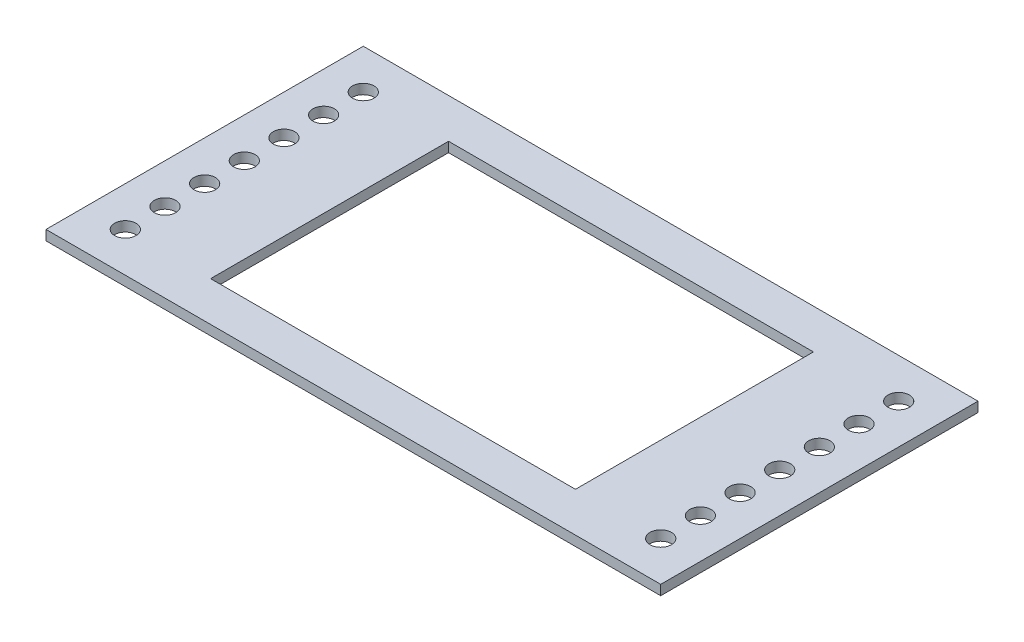
ISO-10303-21;
HEADER;
FILE_DESCRIPTION(('STEP AP214'),'2;1');
FILE_NAME('part.step','',(''),(''),'','','');
FILE_SCHEMA(('AUTOMOTIVE_DESIGN { 1 0 10303 214 1 1 1 1 }'));
ENDSEC;
DATA;
#1=APPLICATION_CONTEXT('core data for automotive mechanical design processes');
#2=APPLICATION_PROTOCOL_DEFINITION('international standard','automotive_design',2000,#1);
#3=PRODUCT_CONTEXT('',#1,'mechanical');
#4=PRODUCT('Part','Part','',(#3));
#5=PRODUCT_RELATED_PRODUCT_CATEGORY('part','',(#4));
#6=PRODUCT_DEFINITION_FORMATION('','',#4);
#7=PRODUCT_DEFINITION_CONTEXT('part definition',#1,'design');
#8=PRODUCT_DEFINITION('design','',#6,#7);
#9=PRODUCT_DEFINITION_SHAPE('','',#8);
#10=(LENGTH_UNIT() NAMED_UNIT(*) SI_UNIT(.MILLI.,.METRE.));
#11=(NAMED_UNIT(*) PLANE_ANGLE_UNIT() SI_UNIT($,.RADIAN.));
#12=(NAMED_UNIT(*) SI_UNIT($,.STERADIAN.) SOLID_ANGLE_UNIT());
#13=UNCERTAINTY_MEASURE_WITH_UNIT(LENGTH_MEASURE(1.E-05),#10,'distance_accuracy_value','');
#14=(GEOMETRIC_REPRESENTATION_CONTEXT(3) GLOBAL_UNCERTAINTY_ASSIGNED_CONTEXT((#13)) GLOBAL_UNIT_ASSIGNED_CONTEXT((#10,
#11,#12)) REPRESENTATION_CONTEXT('',''));
#15=CARTESIAN_POINT('',(0.,0.,0.));
#16=DIRECTION('',(0.,0.,1.));
#17=DIRECTION('',(1.,0.,0.));
#18=AXIS2_PLACEMENT_3D('',#15,#16,#17);
#19=CARTESIAN_POINT('',(0.,3.175,0.));
#20=DIRECTION('',(0.,-1.,0.));
#21=DIRECTION('',(0.,0.,-1.));
#22=AXIS2_PLACEMENT_3D('',#19,#20,#21);
#23=PLANE('',#22);
#24=DIRECTION('',(0.,0.,1.));
#25=VECTOR('',#24,1.);
#26=CARTESIAN_POINT('',(-98.425,3.175,-50.8));
#27=LINE('',#26,#25);
#28=CARTESIAN_POINT('',(-98.425,3.175,-50.8));
#29=VERTEX_POINT('',#28);
#30=CARTESIAN_POINT('',(-98.425,3.175,50.8));
#31=VERTEX_POINT('',#30);
#32=EDGE_CURVE('E137',#29,#31,#27,.T.);
#33=ORIENTED_EDGE('',*,*,#32,.T.);
#34=DIRECTION('',(1.,0.,0.));
#35=VECTOR('',#34,1.);
#36=CARTESIAN_POINT('',(98.425,3.175,50.8));
#37=LINE('',#36,#35);
#38=CARTESIAN_POINT('',(98.425,3.175,50.8));
#39=VERTEX_POINT('',#38);
#40=EDGE_CURVE('E140',#31,#39,#37,.T.);
#41=ORIENTED_EDGE('',*,*,#40,.T.);
#42=DIRECTION('',(0.,0.,-1.));
#43=VECTOR('',#42,1.);
#44=CARTESIAN_POINT('',(98.425,3.175,-50.8));
#45=LINE('',#44,#43);
#46=CARTESIAN_POINT('',(98.425,3.175,-50.8));
#47=VERTEX_POINT('',#46);
#48=EDGE_CURVE('E143',#39,#47,#45,.T.);
#49=ORIENTED_EDGE('',*,*,#48,.T.);
#50=DIRECTION('',(-1.,0.,0.));
#51=VECTOR('',#50,1.);
#52=CARTESIAN_POINT('',(98.425,3.175,-50.8));
#53=LINE('',#52,#51);
#54=EDGE_CURVE('E145',#47,#29,#53,.T.);
#55=ORIENTED_EDGE('',*,*,#54,.T.);
#56=EDGE_LOOP('',(#33,#41,#49,#55));
#57=FACE_BOUND('',#56,.T.);
#58=DIRECTION('',(0.,0.,1.));
#59=VECTOR('',#58,1.);
#60=CARTESIAN_POINT('',(-58.42,3.175,-38.1));
#61=LINE('',#60,#59);
#62=CARTESIAN_POINT('',(-58.42,3.175,-38.1));
#63=VERTEX_POINT('',#62);
#64=CARTESIAN_POINT('',(-58.42,3.175,38.1));
#65=VERTEX_POINT('',#64);
#66=EDGE_CURVE('E98',#63,#65,#61,.T.);
#67=ORIENTED_EDGE('',*,*,#66,.F.);
#68=DIRECTION('',(-1.,0.,0.));
#69=VECTOR('',#68,1.);
#70=CARTESIAN_POINT('',(58.42,3.175,-38.1));
#71=LINE('',#70,#69);
#72=CARTESIAN_POINT('',(58.42,3.175,-38.1));
#73=VERTEX_POINT('',#72);
#74=EDGE_CURVE('E121',#73,#63,#71,.T.);
#75=ORIENTED_EDGE('',*,*,#74,.F.);
#76=DIRECTION('',(0.,0.,-1.));
#77=VECTOR('',#76,1.);
#78=CARTESIAN_POINT('',(58.42,3.175,-38.1));
#79=LINE('',#78,#77);
#80=CARTESIAN_POINT('',(58.42,3.175,38.1));
#81=VERTEX_POINT('',#80);
#82=EDGE_CURVE('E119',#81,#73,#79,.T.);
#83=ORIENTED_EDGE('',*,*,#82,.F.);
#84=DIRECTION('',(1.,0.,0.));
#85=VECTOR('',#84,1.);
#86=CARTESIAN_POINT('',(58.42,3.175,38.1));
#87=LINE('',#86,#85);
#88=EDGE_CURVE('E106',#65,#81,#87,.T.);
#89=ORIENTED_EDGE('',*,*,#88,.F.);
#90=EDGE_LOOP('',(#67,#75,#83,#89));
#91=FACE_BOUND('',#90,.T.);
#92=CARTESIAN_POINT('',(-85.7250000000001,3.175,-38.1));
#93=DIRECTION('',(0.,1.,0.));
#94=DIRECTION('',(0.,0.,1.));
#95=AXIS2_PLACEMENT_3D('',#92,#93,#94);
#96=CIRCLE('',#95,3.429);
#97=CARTESIAN_POINT('',(-85.7250000000001,3.175,-34.671));
#98=VERTEX_POINT('',#97);
#99=EDGE_CURVE('E127',#98,#98,#96,.T.);
#100=ORIENTED_EDGE('',*,*,#99,.F.);
#101=EDGE_LOOP('',(#100));
#102=FACE_BOUND('',#101,.T.);
#103=CARTESIAN_POINT('',(85.725,3.175,-38.1));
#104=DIRECTION('',(0.,1.,0.));
#105=DIRECTION('',(0.,0.,1.));
#106=AXIS2_PLACEMENT_3D('',#103,#104,#105);
#107=CIRCLE('',#106,3.429);
#108=CARTESIAN_POINT('',(85.725,3.175,-34.671));
#109=VERTEX_POINT('',#108);
#110=EDGE_CURVE('E349',#109,#109,#107,.T.);
#111=ORIENTED_EDGE('',*,*,#110,.F.);
#112=EDGE_LOOP('',(#111));
#113=FACE_BOUND('',#112,.T.);
#114=CARTESIAN_POINT('',(85.7250000000001,3.175,-25.4));
#115=DIRECTION('',(0.,1.,0.));
#116=DIRECTION('',(0.,0.,1.));
#117=AXIS2_PLACEMENT_3D('',#114,#115,#116);
#118=CIRCLE('',#117,3.429);
#119=CARTESIAN_POINT('',(85.7250000000001,3.175,-21.971));
#120=VERTEX_POINT('',#119);
#121=EDGE_CURVE('E343',#120,#120,#118,.T.);
#122=ORIENTED_EDGE('',*,*,#121,.F.);
#123=EDGE_LOOP('',(#122));
#124=FACE_BOUND('',#123,.T.);
#125=CARTESIAN_POINT('',(85.7250000000003,3.175,-12.7));
#126=DIRECTION('',(0.,1.,0.));
#127=DIRECTION('',(0.,0.,1.));
#128=AXIS2_PLACEMENT_3D('',#125,#126,#127);
#129=CIRCLE('',#128,3.429);
#130=CARTESIAN_POINT('',(85.7250000000003,3.175,-9.27100000000003));
#131=VERTEX_POINT('',#130);
#132=EDGE_CURVE('E337',#131,#131,#129,.T.);
#133=ORIENTED_EDGE('',*,*,#132,.F.);
#134=EDGE_LOOP('',(#133));
#135=FACE_BOUND('',#134,.T.);
#136=CARTESIAN_POINT('',(85.7250000000003,3.175,0.));
#137=DIRECTION('',(0.,1.,0.));
#138=DIRECTION('',(0.,0.,1.));
#139=AXIS2_PLACEMENT_3D('',#136,#137,#138);
#140=CIRCLE('',#139,3.429);
#141=CARTESIAN_POINT('',(85.7250000000003,3.175,3.42899999999996));
#142=VERTEX_POINT('',#141);
#143=EDGE_CURVE('E331',#142,#142,#140,.T.);
#144=ORIENTED_EDGE('',*,*,#143,.F.);
#145=EDGE_LOOP('',(#144));
#146=FACE_BOUND('',#145,.T.);
#147=CARTESIAN_POINT('',(85.7250000000005,3.175,12.7));
#148=DIRECTION('',(0.,1.,0.));
#149=DIRECTION('',(0.,0.,1.));
#150=AXIS2_PLACEMENT_3D('',#147,#148,#149);
#151=CIRCLE('',#150,3.429);
#152=CARTESIAN_POINT('',(85.7250000000005,3.175,16.129));
#153=VERTEX_POINT('',#152);
#154=EDGE_CURVE('E325',#153,#153,#151,.T.);
#155=ORIENTED_EDGE('',*,*,#154,.F.);
#156=EDGE_LOOP('',(#155));
#157=FACE_BOUND('',#156,.T.);
#158=CARTESIAN_POINT('',(85.7250000000006,3.175,25.3999999999999));
#159=DIRECTION('',(0.,1.,0.));
#160=DIRECTION('',(0.,0.,1.));
#161=AXIS2_PLACEMENT_3D('',#158,#159,#160);
#162=CIRCLE('',#161,3.429);
#163=CARTESIAN_POINT('',(85.7250000000006,3.175,28.8289999999999));
#164=VERTEX_POINT('',#163);
#165=EDGE_CURVE('E319',#164,#164,#162,.T.);
#166=ORIENTED_EDGE('',*,*,#165,.F.);
#167=EDGE_LOOP('',(#166));
#168=FACE_BOUND('',#167,.T.);
#169=CARTESIAN_POINT('',(85.7250000000008,3.175,38.0999999999999));
#170=DIRECTION('',(0.,1.,0.));
#171=DIRECTION('',(0.,0.,1.));
#172=AXIS2_PLACEMENT_3D('',#169,#170,#171);
#173=CIRCLE('',#172,3.429);
#174=CARTESIAN_POINT('',(85.7250000000008,3.175,41.5289999999999));
#175=VERTEX_POINT('',#174);
#176=EDGE_CURVE('E313',#175,#175,#173,.T.);
#177=ORIENTED_EDGE('',*,*,#176,.F.);
#178=EDGE_LOOP('',(#177));
#179=FACE_BOUND('',#178,.T.);
#180=CARTESIAN_POINT('',(-85.7249999999999,3.175,-25.4));
#181=DIRECTION('',(0.,1.,0.));
#182=DIRECTION('',(0.,0.,1.));
#183=AXIS2_PLACEMENT_3D('',#180,#181,#182);
#184=CIRCLE('',#183,3.429);
#185=CARTESIAN_POINT('',(-85.7249999999999,3.175,-21.971));
#186=VERTEX_POINT('',#185);
#187=EDGE_CURVE('E307',#186,#186,#184,.T.);
#188=ORIENTED_EDGE('',*,*,#187,.F.);
#189=EDGE_LOOP('',(#188));
#190=FACE_BOUND('',#189,.T.);
#191=CARTESIAN_POINT('',(-85.7249999999998,3.175,-12.7));
#192=DIRECTION('',(0.,1.,0.));
#193=DIRECTION('',(0.,0.,1.));
#194=AXIS2_PLACEMENT_3D('',#191,#192,#193);
#195=CIRCLE('',#194,3.429);
#196=CARTESIAN_POINT('',(-85.7249999999998,3.175,-9.27100000000003));
#197=VERTEX_POINT('',#196);
#198=EDGE_CURVE('E301',#197,#197,#195,.T.);
#199=ORIENTED_EDGE('',*,*,#198,.F.);
#200=EDGE_LOOP('',(#199));
#201=FACE_BOUND('',#200,.T.);
#202=CARTESIAN_POINT('',(-85.7249999999997,3.175,0.));
#203=DIRECTION('',(0.,1.,0.));
#204=DIRECTION('',(0.,0.,1.));
#205=AXIS2_PLACEMENT_3D('',#202,#203,#204);
#206=CIRCLE('',#205,3.429);
#207=CARTESIAN_POINT('',(-85.7249999999997,3.175,3.42899999999996));
#208=VERTEX_POINT('',#207);
#209=EDGE_CURVE('E295',#208,#208,#206,.T.);
#210=ORIENTED_EDGE('',*,*,#209,.F.);
#211=EDGE_LOOP('',(#210));
#212=FACE_BOUND('',#211,.T.);
#213=CARTESIAN_POINT('',(-85.7249999999995,3.175,12.7));
#214=DIRECTION('',(0.,1.,0.));
#215=DIRECTION('',(0.,0.,1.));
#216=AXIS2_PLACEMENT_3D('',#213,#214,#215);
#217=CIRCLE('',#216,3.429);
#218=CARTESIAN_POINT('',(-85.7249999999995,3.175,16.129));
#219=VERTEX_POINT('',#218);
#220=EDGE_CURVE('E289',#219,#219,#217,.T.);
#221=ORIENTED_EDGE('',*,*,#220,.F.);
#222=EDGE_LOOP('',(#221));
#223=FACE_BOUND('',#222,.T.);
#224=CARTESIAN_POINT('',(-85.7249999999994,3.175,25.3999999999999));
#225=DIRECTION('',(0.,1.,0.));
#226=DIRECTION('',(0.,0.,1.));
#227=AXIS2_PLACEMENT_3D('',#224,#225,#226);
#228=CIRCLE('',#227,3.429);
#229=CARTESIAN_POINT('',(-85.7249999999994,3.175,28.8289999999999));
#230=VERTEX_POINT('',#229);
#231=EDGE_CURVE('E283',#230,#230,#228,.T.);
#232=ORIENTED_EDGE('',*,*,#231,.F.);
#233=EDGE_LOOP('',(#232));
#234=FACE_BOUND('',#233,.T.);
#235=CARTESIAN_POINT('',(-85.7249999999992,3.175,38.0999999999999));
#236=DIRECTION('',(0.,1.,0.));
#237=DIRECTION('',(0.,0.,1.));
#238=AXIS2_PLACEMENT_3D('',#235,#236,#237);
#239=CIRCLE('',#238,3.429);
#240=CARTESIAN_POINT('',(-85.7249999999992,3.175,41.5289999999999));
#241=VERTEX_POINT('',#240);
#242=EDGE_CURVE('E274',#241,#241,#239,.T.);
#243=ORIENTED_EDGE('',*,*,#242,.F.);
#244=EDGE_LOOP('',(#243));
#245=FACE_BOUND('',#244,.T.);
#246=ADVANCED_FACE('F33',(#57,#91,#102,#113,#124,#135,#146,#157,#168,#179,#190,#201,#212,#223,
#234,#245),#23,.F.);
#247=CARTESIAN_POINT('',(0.,0.,0.));
#248=DIRECTION('',(0.,-1.,0.));
#249=DIRECTION('',(0.,0.,-1.));
#250=AXIS2_PLACEMENT_3D('',#247,#248,#249);
#251=PLANE('',#250);
#252=CARTESIAN_POINT('',(-85.7249999999994,0.,25.3999999999999));
#253=DIRECTION('',(0.,1.,0.));
#254=DIRECTION('',(0.,0.,1.));
#255=AXIS2_PLACEMENT_3D('',#252,#253,#254);
#256=CIRCLE('',#255,3.429);
#257=CARTESIAN_POINT('',(-85.7249999999994,0.,28.8289999999999));
#258=VERTEX_POINT('',#257);
#259=EDGE_CURVE('E280',#258,#258,#256,.T.);
#260=ORIENTED_EDGE('',*,*,#259,.T.);
#261=EDGE_LOOP('',(#260));
#262=FACE_BOUND('',#261,.T.);
#263=CARTESIAN_POINT('',(-85.7249999999997,0.,0.));
#264=DIRECTION('',(0.,1.,0.));
#265=DIRECTION('',(0.,0.,1.));
#266=AXIS2_PLACEMENT_3D('',#263,#264,#265);
#267=CIRCLE('',#266,3.429);
#268=CARTESIAN_POINT('',(-85.7249999999997,0.,3.42899999999996));
#269=VERTEX_POINT('',#268);
#270=EDGE_CURVE('E292',#269,#269,#267,.T.);
#271=ORIENTED_EDGE('',*,*,#270,.T.);
#272=EDGE_LOOP('',(#271));
#273=FACE_BOUND('',#272,.T.);
#274=CARTESIAN_POINT('',(-85.7249999999999,0.,-25.4));
#275=DIRECTION('',(0.,1.,0.));
#276=DIRECTION('',(0.,0.,1.));
#277=AXIS2_PLACEMENT_3D('',#274,#275,#276);
#278=CIRCLE('',#277,3.429);
#279=CARTESIAN_POINT('',(-85.7249999999999,0.,-21.971));
#280=VERTEX_POINT('',#279);
#281=EDGE_CURVE('E304',#280,#280,#278,.T.);
#282=ORIENTED_EDGE('',*,*,#281,.T.);
#283=EDGE_LOOP('',(#282));
#284=FACE_BOUND('',#283,.T.);
#285=CARTESIAN_POINT('',(85.7250000000006,0.,25.3999999999999));
#286=DIRECTION('',(0.,1.,0.));
#287=DIRECTION('',(0.,0.,1.));
#288=AXIS2_PLACEMENT_3D('',#285,#286,#287);
#289=CIRCLE('',#288,3.429);
#290=CARTESIAN_POINT('',(85.7250000000006,0.,28.8289999999999));
#291=VERTEX_POINT('',#290);
#292=EDGE_CURVE('E316',#291,#291,#289,.T.);
#293=ORIENTED_EDGE('',*,*,#292,.T.);
#294=EDGE_LOOP('',(#293));
#295=FACE_BOUND('',#294,.T.);
#296=CARTESIAN_POINT('',(85.7250000000003,0.,0.));
#297=DIRECTION('',(0.,1.,0.));
#298=DIRECTION('',(0.,0.,1.));
#299=AXIS2_PLACEMENT_3D('',#296,#297,#298);
#300=CIRCLE('',#299,3.429);
#301=CARTESIAN_POINT('',(85.7250000000003,0.,3.42899999999996));
#302=VERTEX_POINT('',#301);
#303=EDGE_CURVE('E328',#302,#302,#300,.T.);
#304=ORIENTED_EDGE('',*,*,#303,.T.);
#305=EDGE_LOOP('',(#304));
#306=FACE_BOUND('',#305,.T.);
#307=CARTESIAN_POINT('',(85.7250000000001,0.,-25.4));
#308=DIRECTION('',(0.,1.,0.));
#309=DIRECTION('',(0.,0.,1.));
#310=AXIS2_PLACEMENT_3D('',#307,#308,#309);
#311=CIRCLE('',#310,3.429);
#312=CARTESIAN_POINT('',(85.7250000000001,0.,-21.971));
#313=VERTEX_POINT('',#312);
#314=EDGE_CURVE('E340',#313,#313,#311,.T.);
#315=ORIENTED_EDGE('',*,*,#314,.T.);
#316=EDGE_LOOP('',(#315));
#317=FACE_BOUND('',#316,.T.);
#318=CARTESIAN_POINT('',(-85.7250000000001,0.,-38.1));
#319=DIRECTION('',(0.,1.,0.));
#320=DIRECTION('',(0.,0.,1.));
#321=AXIS2_PLACEMENT_3D('',#318,#319,#320);
#322=CIRCLE('',#321,3.429);
#323=CARTESIAN_POINT('',(-85.7250000000001,0.,-34.671));
#324=VERTEX_POINT('',#323);
#325=EDGE_CURVE('E352',#324,#324,#322,.T.);
#326=ORIENTED_EDGE('',*,*,#325,.T.);
#327=EDGE_LOOP('',(#326));
#328=FACE_BOUND('',#327,.T.);
#329=DIRECTION('',(0.,0.,1.));
#330=VECTOR('',#329,1.);
#331=CARTESIAN_POINT('',(-98.425,0.,-50.8));
#332=LINE('',#331,#330);
#333=CARTESIAN_POINT('',(-98.425,0.,-50.8));
#334=VERTEX_POINT('',#333);
#335=CARTESIAN_POINT('',(-98.425,0.,50.8));
#336=VERTEX_POINT('',#335);
#337=EDGE_CURVE('E114',#334,#336,#332,.T.);
#338=ORIENTED_EDGE('',*,*,#337,.F.);
#339=DIRECTION('',(-1.,0.,0.));
#340=VECTOR('',#339,1.);
#341=CARTESIAN_POINT('',(98.425,0.,-50.8));
#342=LINE('',#341,#340);
#343=CARTESIAN_POINT('',(98.425,0.,-50.8));
#344=VERTEX_POINT('',#343);
#345=EDGE_CURVE('E141',#344,#334,#342,.T.);
#346=ORIENTED_EDGE('',*,*,#345,.F.);
#347=DIRECTION('',(0.,0.,-1.));
#348=VECTOR('',#347,1.);
#349=CARTESIAN_POINT('',(98.425,0.,-50.8));
#350=LINE('',#349,#348);
#351=CARTESIAN_POINT('',(98.425,0.,50.8));
#352=VERTEX_POINT('',#351);
#353=EDGE_CURVE('E152',#352,#344,#350,.T.);
#354=ORIENTED_EDGE('',*,*,#353,.F.);
#355=DIRECTION('',(1.,0.,0.));
#356=VECTOR('',#355,1.);
#357=CARTESIAN_POINT('',(98.425,0.,50.8));
#358=LINE('',#357,#356);
#359=EDGE_CURVE('E150',#336,#352,#358,.T.);
#360=ORIENTED_EDGE('',*,*,#359,.F.);
#361=EDGE_LOOP('',(#338,#346,#354,#360));
#362=FACE_BOUND('',#361,.T.);
#363=DIRECTION('',(-1.,0.,0.));
#364=VECTOR('',#363,1.);
#365=CARTESIAN_POINT('',(58.42,0.,-38.1));
#366=LINE('',#365,#364);
#367=CARTESIAN_POINT('',(58.42,0.,-38.1));
#368=VERTEX_POINT('',#367);
#369=CARTESIAN_POINT('',(-58.42,0.,-38.1));
#370=VERTEX_POINT('',#369);
#371=EDGE_CURVE('E107',#368,#370,#366,.T.);
#372=ORIENTED_EDGE('',*,*,#371,.T.);
#373=DIRECTION('',(0.,0.,1.));
#374=VECTOR('',#373,1.);
#375=CARTESIAN_POINT('',(-58.42,0.,-38.1));
#376=LINE('',#375,#374);
#377=CARTESIAN_POINT('',(-58.42,0.,38.1));
#378=VERTEX_POINT('',#377);
#379=EDGE_CURVE('E56',#370,#378,#376,.T.);
#380=ORIENTED_EDGE('',*,*,#379,.T.);
#381=DIRECTION('',(1.,0.,0.));
#382=VECTOR('',#381,1.);
#383=CARTESIAN_POINT('',(58.42,0.,38.1));
#384=LINE('',#383,#382);
#385=CARTESIAN_POINT('',(58.42,0.,38.1));
#386=VERTEX_POINT('',#385);
#387=EDGE_CURVE('E113',#378,#386,#384,.T.);
#388=ORIENTED_EDGE('',*,*,#387,.T.);
#389=DIRECTION('',(0.,0.,-1.));
#390=VECTOR('',#389,1.);
#391=CARTESIAN_POINT('',(58.42,0.,-38.1));
#392=LINE('',#391,#390);
#393=EDGE_CURVE('E129',#386,#368,#392,.T.);
#394=ORIENTED_EDGE('',*,*,#393,.T.);
#395=EDGE_LOOP('',(#372,#380,#388,#394));
#396=FACE_BOUND('',#395,.T.);
#397=CARTESIAN_POINT('',(85.725,0.,-38.1));
#398=DIRECTION('',(0.,1.,0.));
#399=DIRECTION('',(0.,0.,1.));
#400=AXIS2_PLACEMENT_3D('',#397,#398,#399);
#401=CIRCLE('',#400,3.429);
#402=CARTESIAN_POINT('',(85.725,0.,-34.671));
#403=VERTEX_POINT('',#402);
#404=EDGE_CURVE('E346',#403,#403,#401,.T.);
#405=ORIENTED_EDGE('',*,*,#404,.T.);
#406=EDGE_LOOP('',(#405));
#407=FACE_BOUND('',#406,.T.);
#408=CARTESIAN_POINT('',(85.7250000000003,0.,-12.7));
#409=DIRECTION('',(0.,1.,0.));
#410=DIRECTION('',(0.,0.,1.));
#411=AXIS2_PLACEMENT_3D('',#408,#409,#410);
#412=CIRCLE('',#411,3.429);
#413=CARTESIAN_POINT('',(85.7250000000003,0.,-9.27100000000003));
#414=VERTEX_POINT('',#413);
#415=EDGE_CURVE('E334',#414,#414,#412,.T.);
#416=ORIENTED_EDGE('',*,*,#415,.T.);
#417=EDGE_LOOP('',(#416));
#418=FACE_BOUND('',#417,.T.);
#419=CARTESIAN_POINT('',(85.7250000000005,0.,12.7));
#420=DIRECTION('',(0.,1.,0.));
#421=DIRECTION('',(0.,0.,1.));
#422=AXIS2_PLACEMENT_3D('',#419,#420,#421);
#423=CIRCLE('',#422,3.429);
#424=CARTESIAN_POINT('',(85.7250000000005,0.,16.129));
#425=VERTEX_POINT('',#424);
#426=EDGE_CURVE('E322',#425,#425,#423,.T.);
#427=ORIENTED_EDGE('',*,*,#426,.T.);
#428=EDGE_LOOP('',(#427));
#429=FACE_BOUND('',#428,.T.);
#430=CARTESIAN_POINT('',(85.7250000000008,0.,38.0999999999999));
#431=DIRECTION('',(0.,1.,0.));
#432=DIRECTION('',(0.,0.,1.));
#433=AXIS2_PLACEMENT_3D('',#430,#431,#432);
#434=CIRCLE('',#433,3.429);
#435=CARTESIAN_POINT('',(85.7250000000008,0.,41.5289999999999));
#436=VERTEX_POINT('',#435);
#437=EDGE_CURVE('E310',#436,#436,#434,.T.);
#438=ORIENTED_EDGE('',*,*,#437,.T.);
#439=EDGE_LOOP('',(#438));
#440=FACE_BOUND('',#439,.T.);
#441=CARTESIAN_POINT('',(-85.7249999999998,0.,-12.7));
#442=DIRECTION('',(0.,1.,0.));
#443=DIRECTION('',(0.,0.,1.));
#444=AXIS2_PLACEMENT_3D('',#441,#442,#443);
#445=CIRCLE('',#444,3.429);
#446=CARTESIAN_POINT('',(-85.7249999999998,0.,-9.27100000000003));
#447=VERTEX_POINT('',#446);
#448=EDGE_CURVE('E298',#447,#447,#445,.T.);
#449=ORIENTED_EDGE('',*,*,#448,.T.);
#450=EDGE_LOOP('',(#449));
#451=FACE_BOUND('',#450,.T.);
#452=CARTESIAN_POINT('',(-85.7249999999995,0.,12.7));
#453=DIRECTION('',(0.,1.,0.));
#454=DIRECTION('',(0.,0.,1.));
#455=AXIS2_PLACEMENT_3D('',#452,#453,#454);
#456=CIRCLE('',#455,3.429);
#457=CARTESIAN_POINT('',(-85.7249999999995,0.,16.129));
#458=VERTEX_POINT('',#457);
#459=EDGE_CURVE('E286',#458,#458,#456,.T.);
#460=ORIENTED_EDGE('',*,*,#459,.T.);
#461=EDGE_LOOP('',(#460));
#462=FACE_BOUND('',#461,.T.);
#463=CARTESIAN_POINT('',(-85.7249999999992,0.,38.0999999999999));
#464=DIRECTION('',(0.,1.,0.));
#465=DIRECTION('',(0.,0.,1.));
#466=AXIS2_PLACEMENT_3D('',#463,#464,#465);
#467=CIRCLE('',#466,3.429);
#468=CARTESIAN_POINT('',(-85.7249999999992,0.,41.5289999999999));
#469=VERTEX_POINT('',#468);
#470=EDGE_CURVE('E277',#469,#469,#467,.T.);
#471=ORIENTED_EDGE('',*,*,#470,.T.);
#472=EDGE_LOOP('',(#471));
#473=FACE_BOUND('',#472,.T.);
#474=ADVANCED_FACE('F170',(#262,#273,#284,#295,#306,#317,#328,#362,#396,#407,#418,#429,#440,
#451,#462,#473),#251,.T.);
#475=CARTESIAN_POINT('',(-98.425,3.175,-50.8));
#476=DIRECTION('',(1.,0.,0.));
#477=DIRECTION('',(0.,0.,-1.));
#478=AXIS2_PLACEMENT_3D('',#475,#476,#477);
#479=PLANE('',#478);
#480=ORIENTED_EDGE('',*,*,#337,.T.);
#481=DIRECTION('',(0.,-1.,0.));
#482=VECTOR('',#481,1.);
#483=CARTESIAN_POINT('',(-98.425,3.175,50.8));
#484=LINE('',#483,#482);
#485=EDGE_CURVE('E11',#31,#336,#484,.T.);
#486=ORIENTED_EDGE('',*,*,#485,.F.);
#487=ORIENTED_EDGE('',*,*,#32,.F.);
#488=DIRECTION('',(0.,-1.,0.));
#489=VECTOR('',#488,1.);
#490=CARTESIAN_POINT('',(-98.425,3.175,-50.8));
#491=LINE('',#490,#489);
#492=EDGE_CURVE('E147',#29,#334,#491,.T.);
#493=ORIENTED_EDGE('',*,*,#492,.T.);
#494=EDGE_LOOP('',(#480,#486,#487,#493));
#495=FACE_BOUND('',#494,.T.);
#496=ADVANCED_FACE('F35',(#495),#479,.F.);
#497=CARTESIAN_POINT('',(98.425,3.175,50.8));
#498=DIRECTION('',(0.,0.,-1.));
#499=DIRECTION('',(-1.,0.,0.));
#500=AXIS2_PLACEMENT_3D('',#497,#498,#499);
#501=PLANE('',#500);
#502=ORIENTED_EDGE('',*,*,#359,.T.);
#503=DIRECTION('',(0.,-1.,0.));
#504=VECTOR('',#503,1.);
#505=CARTESIAN_POINT('',(98.425,3.175,50.8));
#506=LINE('',#505,#504);
#507=EDGE_CURVE('E41',#39,#352,#506,.T.);
#508=ORIENTED_EDGE('',*,*,#507,.F.);
#509=ORIENTED_EDGE('',*,*,#40,.F.);
#510=ORIENTED_EDGE('',*,*,#485,.T.);
#511=EDGE_LOOP('',(#502,#508,#509,#510));
#512=FACE_BOUND('',#511,.T.);
#513=ADVANCED_FACE('F180',(#512),#501,.F.);
#514=CARTESIAN_POINT('',(98.425,3.175,-50.8));
#515=DIRECTION('',(-1.,0.,0.));
#516=DIRECTION('',(0.,0.,1.));
#517=AXIS2_PLACEMENT_3D('',#514,#515,#516);
#518=PLANE('',#517);
#519=ORIENTED_EDGE('',*,*,#353,.T.);
#520=DIRECTION('',(0.,-1.,0.));
#521=VECTOR('',#520,1.);
#522=CARTESIAN_POINT('',(98.425,3.175,-50.8));
#523=LINE('',#522,#521);
#524=EDGE_CURVE('E157',#47,#344,#523,.T.);
#525=ORIENTED_EDGE('',*,*,#524,.F.);
#526=ORIENTED_EDGE('',*,*,#48,.F.);
#527=ORIENTED_EDGE('',*,*,#507,.T.);
#528=EDGE_LOOP('',(#519,#525,#526,#527));
#529=FACE_BOUND('',#528,.T.);
#530=ADVANCED_FACE('F164',(#529),#518,.F.);
#531=CARTESIAN_POINT('',(98.425,3.175,-50.8));
#532=DIRECTION('',(0.,0.,1.));
#533=DIRECTION('',(1.,0.,0.));
#534=AXIS2_PLACEMENT_3D('',#531,#532,#533);
#535=PLANE('',#534);
#536=ORIENTED_EDGE('',*,*,#345,.T.);
#537=ORIENTED_EDGE('',*,*,#492,.F.);
#538=ORIENTED_EDGE('',*,*,#54,.F.);
#539=ORIENTED_EDGE('',*,*,#524,.T.);
#540=EDGE_LOOP('',(#536,#537,#538,#539));
#541=FACE_BOUND('',#540,.T.);
#542=ADVANCED_FACE('F174',(#541),#535,.F.);
#543=CARTESIAN_POINT('',(-58.42,3.175,-38.1));
#544=DIRECTION('',(1.,0.,0.));
#545=DIRECTION('',(0.,0.,-1.));
#546=AXIS2_PLACEMENT_3D('',#543,#544,#545);
#547=PLANE('',#546);
#548=ORIENTED_EDGE('',*,*,#379,.F.);
#549=DIRECTION('',(0.,-1.,0.));
#550=VECTOR('',#549,1.);
#551=CARTESIAN_POINT('',(-58.42,3.175,-38.1));
#552=LINE('',#551,#550);
#553=EDGE_CURVE('E102',#63,#370,#552,.T.);
#554=ORIENTED_EDGE('',*,*,#553,.F.);
#555=ORIENTED_EDGE('',*,*,#66,.T.);
#556=DIRECTION('',(0.,-1.,0.));
#557=VECTOR('',#556,1.);
#558=CARTESIAN_POINT('',(-58.42,3.175,38.1));
#559=LINE('',#558,#557);
#560=EDGE_CURVE('E101',#65,#378,#559,.T.);
#561=ORIENTED_EDGE('',*,*,#560,.T.);
#562=EDGE_LOOP('',(#548,#554,#555,#561));
#563=FACE_BOUND('',#562,.T.);
#564=ADVANCED_FACE('F100',(#563),#547,.T.);
#565=CARTESIAN_POINT('',(58.42,3.175,38.1));
#566=DIRECTION('',(0.,0.,-1.));
#567=DIRECTION('',(-1.,0.,0.));
#568=AXIS2_PLACEMENT_3D('',#565,#566,#567);
#569=PLANE('',#568);
#570=ORIENTED_EDGE('',*,*,#387,.F.);
#571=ORIENTED_EDGE('',*,*,#560,.F.);
#572=ORIENTED_EDGE('',*,*,#88,.T.);
#573=DIRECTION('',(0.,-1.,0.));
#574=VECTOR('',#573,1.);
#575=CARTESIAN_POINT('',(58.42,3.175,38.1));
#576=LINE('',#575,#574);
#577=EDGE_CURVE('E115',#81,#386,#576,.T.);
#578=ORIENTED_EDGE('',*,*,#577,.T.);
#579=EDGE_LOOP('',(#570,#571,#572,#578));
#580=FACE_BOUND('',#579,.T.);
#581=ADVANCED_FACE('F110',(#580),#569,.T.);
#582=CARTESIAN_POINT('',(58.42,3.175,-38.1));
#583=DIRECTION('',(-1.,0.,0.));
#584=DIRECTION('',(0.,0.,1.));
#585=AXIS2_PLACEMENT_3D('',#582,#583,#584);
#586=PLANE('',#585);
#587=ORIENTED_EDGE('',*,*,#393,.F.);
#588=ORIENTED_EDGE('',*,*,#577,.F.);
#589=ORIENTED_EDGE('',*,*,#82,.T.);
#590=DIRECTION('',(0.,-1.,0.));
#591=VECTOR('',#590,1.);
#592=CARTESIAN_POINT('',(58.42,3.175,-38.1));
#593=LINE('',#592,#591);
#594=EDGE_CURVE('E48',#73,#368,#593,.T.);
#595=ORIENTED_EDGE('',*,*,#594,.T.);
#596=EDGE_LOOP('',(#587,#588,#589,#595));
#597=FACE_BOUND('',#596,.T.);
#598=ADVANCED_FACE('F204',(#597),#586,.T.);
#599=CARTESIAN_POINT('',(58.42,3.175,-38.1));
#600=DIRECTION('',(0.,0.,1.));
#601=DIRECTION('',(1.,0.,0.));
#602=AXIS2_PLACEMENT_3D('',#599,#600,#601);
#603=PLANE('',#602);
#604=ORIENTED_EDGE('',*,*,#371,.F.);
#605=ORIENTED_EDGE('',*,*,#594,.F.);
#606=ORIENTED_EDGE('',*,*,#74,.T.);
#607=ORIENTED_EDGE('',*,*,#553,.T.);
#608=EDGE_LOOP('',(#604,#605,#606,#607));
#609=FACE_BOUND('',#608,.T.);
#610=ADVANCED_FACE('F208',(#609),#603,.T.);
#611=CARTESIAN_POINT('',(-85.7250000000001,3.175,-38.1));
#612=DIRECTION('',(0.,-1.,0.));
#613=DIRECTION('',(0.,0.,-1.));
#614=AXIS2_PLACEMENT_3D('',#611,#612,#613);
#615=CYLINDRICAL_SURFACE('',#614,3.429);
#616=ORIENTED_EDGE('',*,*,#99,.T.);
#617=EDGE_LOOP('',(#616));
#618=FACE_BOUND('',#617,.T.);
#619=ORIENTED_EDGE('',*,*,#325,.F.);
#620=EDGE_LOOP('',(#619));
#621=FACE_BOUND('',#620,.T.);
#622=ADVANCED_FACE('F214',(#618,#621),#615,.F.);
#623=CARTESIAN_POINT('',(85.725,3.175,-38.1));
#624=DIRECTION('',(0.,-1.,0.));
#625=DIRECTION('',(0.,0.,-1.));
#626=AXIS2_PLACEMENT_3D('',#623,#624,#625);
#627=CYLINDRICAL_SURFACE('',#626,3.429);
#628=ORIENTED_EDGE('',*,*,#110,.T.);
#629=EDGE_LOOP('',(#628));
#630=FACE_BOUND('',#629,.T.);
#631=ORIENTED_EDGE('',*,*,#404,.F.);
#632=EDGE_LOOP('',(#631));
#633=FACE_BOUND('',#632,.T.);
#634=ADVANCED_FACE('F217',(#630,#633),#627,.F.);
#635=CARTESIAN_POINT('',(85.7250000000001,3.175,-25.4));
#636=DIRECTION('',(0.,-1.,0.));
#637=DIRECTION('',(0.,0.,-1.));
#638=AXIS2_PLACEMENT_3D('',#635,#636,#637);
#639=CYLINDRICAL_SURFACE('',#638,3.429);
#640=ORIENTED_EDGE('',*,*,#121,.T.);
#641=EDGE_LOOP('',(#640));
#642=FACE_BOUND('',#641,.T.);
#643=ORIENTED_EDGE('',*,*,#314,.F.);
#644=EDGE_LOOP('',(#643));
#645=FACE_BOUND('',#644,.T.);
#646=ADVANCED_FACE('F221',(#642,#645),#639,.F.);
#647=CARTESIAN_POINT('',(85.7250000000003,3.175,-12.7));
#648=DIRECTION('',(0.,-1.,0.));
#649=DIRECTION('',(0.,0.,-1.));
#650=AXIS2_PLACEMENT_3D('',#647,#648,#649);
#651=CYLINDRICAL_SURFACE('',#650,3.429);
#652=ORIENTED_EDGE('',*,*,#132,.T.);
#653=EDGE_LOOP('',(#652));
#654=FACE_BOUND('',#653,.T.);
#655=ORIENTED_EDGE('',*,*,#415,.F.);
#656=EDGE_LOOP('',(#655));
#657=FACE_BOUND('',#656,.T.);
#658=ADVANCED_FACE('F225',(#654,#657),#651,.F.);
#659=CARTESIAN_POINT('',(85.7250000000003,3.175,0.));
#660=DIRECTION('',(0.,-1.,0.));
#661=DIRECTION('',(0.,0.,-1.));
#662=AXIS2_PLACEMENT_3D('',#659,#660,#661);
#663=CYLINDRICAL_SURFACE('',#662,3.429);
#664=ORIENTED_EDGE('',*,*,#143,.T.);
#665=EDGE_LOOP('',(#664));
#666=FACE_BOUND('',#665,.T.);
#667=ORIENTED_EDGE('',*,*,#303,.F.);
#668=EDGE_LOOP('',(#667));
#669=FACE_BOUND('',#668,.T.);
#670=ADVANCED_FACE('F229',(#666,#669),#663,.F.);
#671=CARTESIAN_POINT('',(85.7250000000005,3.175,12.7));
#672=DIRECTION('',(0.,-1.,0.));
#673=DIRECTION('',(0.,0.,-1.));
#674=AXIS2_PLACEMENT_3D('',#671,#672,#673);
#675=CYLINDRICAL_SURFACE('',#674,3.429);
#676=ORIENTED_EDGE('',*,*,#154,.T.);
#677=EDGE_LOOP('',(#676));
#678=FACE_BOUND('',#677,.T.);
#679=ORIENTED_EDGE('',*,*,#426,.F.);
#680=EDGE_LOOP('',(#679));
#681=FACE_BOUND('',#680,.T.);
#682=ADVANCED_FACE('F233',(#678,#681),#675,.F.);
#683=CARTESIAN_POINT('',(85.7250000000006,3.175,25.3999999999999));
#684=DIRECTION('',(0.,-1.,0.));
#685=DIRECTION('',(0.,0.,-1.));
#686=AXIS2_PLACEMENT_3D('',#683,#684,#685);
#687=CYLINDRICAL_SURFACE('',#686,3.429);
#688=ORIENTED_EDGE('',*,*,#165,.T.);
#689=EDGE_LOOP('',(#688));
#690=FACE_BOUND('',#689,.T.);
#691=ORIENTED_EDGE('',*,*,#292,.F.);
#692=EDGE_LOOP('',(#691));
#693=FACE_BOUND('',#692,.T.);
#694=ADVANCED_FACE('F237',(#690,#693),#687,.F.);
#695=CARTESIAN_POINT('',(85.7250000000008,3.175,38.0999999999999));
#696=DIRECTION('',(0.,-1.,0.));
#697=DIRECTION('',(0.,0.,-1.));
#698=AXIS2_PLACEMENT_3D('',#695,#696,#697);
#699=CYLINDRICAL_SURFACE('',#698,3.429);
#700=ORIENTED_EDGE('',*,*,#176,.T.);
#701=EDGE_LOOP('',(#700));
#702=FACE_BOUND('',#701,.T.);
#703=ORIENTED_EDGE('',*,*,#437,.F.);
#704=EDGE_LOOP('',(#703));
#705=FACE_BOUND('',#704,.T.);
#706=ADVANCED_FACE('F241',(#702,#705),#699,.F.);
#707=CARTESIAN_POINT('',(-85.7249999999999,3.175,-25.4));
#708=DIRECTION('',(0.,-1.,0.));
#709=DIRECTION('',(0.,0.,-1.));
#710=AXIS2_PLACEMENT_3D('',#707,#708,#709);
#711=CYLINDRICAL_SURFACE('',#710,3.429);
#712=ORIENTED_EDGE('',*,*,#187,.T.);
#713=EDGE_LOOP('',(#712));
#714=FACE_BOUND('',#713,.T.);
#715=ORIENTED_EDGE('',*,*,#281,.F.);
#716=EDGE_LOOP('',(#715));
#717=FACE_BOUND('',#716,.T.);
#718=ADVANCED_FACE('F245',(#714,#717),#711,.F.);
#719=CARTESIAN_POINT('',(-85.7249999999998,3.175,-12.7));
#720=DIRECTION('',(0.,-1.,0.));
#721=DIRECTION('',(0.,0.,-1.));
#722=AXIS2_PLACEMENT_3D('',#719,#720,#721);
#723=CYLINDRICAL_SURFACE('',#722,3.429);
#724=ORIENTED_EDGE('',*,*,#198,.T.);
#725=EDGE_LOOP('',(#724));
#726=FACE_BOUND('',#725,.T.);
#727=ORIENTED_EDGE('',*,*,#448,.F.);
#728=EDGE_LOOP('',(#727));
#729=FACE_BOUND('',#728,.T.);
#730=ADVANCED_FACE('F249',(#726,#729),#723,.F.);
#731=CARTESIAN_POINT('',(-85.7249999999997,3.175,0.));
#732=DIRECTION('',(0.,-1.,0.));
#733=DIRECTION('',(0.,0.,-1.));
#734=AXIS2_PLACEMENT_3D('',#731,#732,#733);
#735=CYLINDRICAL_SURFACE('',#734,3.429);
#736=ORIENTED_EDGE('',*,*,#209,.T.);
#737=EDGE_LOOP('',(#736));
#738=FACE_BOUND('',#737,.T.);
#739=ORIENTED_EDGE('',*,*,#270,.F.);
#740=EDGE_LOOP('',(#739));
#741=FACE_BOUND('',#740,.T.);
#742=ADVANCED_FACE('F253',(#738,#741),#735,.F.);
#743=CARTESIAN_POINT('',(-85.7249999999995,3.175,12.7));
#744=DIRECTION('',(0.,-1.,0.));
#745=DIRECTION('',(0.,0.,-1.));
#746=AXIS2_PLACEMENT_3D('',#743,#744,#745);
#747=CYLINDRICAL_SURFACE('',#746,3.429);
#748=ORIENTED_EDGE('',*,*,#220,.T.);
#749=EDGE_LOOP('',(#748));
#750=FACE_BOUND('',#749,.T.);
#751=ORIENTED_EDGE('',*,*,#459,.F.);
#752=EDGE_LOOP('',(#751));
#753=FACE_BOUND('',#752,.T.);
#754=ADVANCED_FACE('F257',(#750,#753),#747,.F.);
#755=CARTESIAN_POINT('',(-85.7249999999994,3.175,25.3999999999999));
#756=DIRECTION('',(0.,-1.,0.));
#757=DIRECTION('',(0.,0.,-1.));
#758=AXIS2_PLACEMENT_3D('',#755,#756,#757);
#759=CYLINDRICAL_SURFACE('',#758,3.429);
#760=ORIENTED_EDGE('',*,*,#231,.T.);
#761=EDGE_LOOP('',(#760));
#762=FACE_BOUND('',#761,.T.);
#763=ORIENTED_EDGE('',*,*,#259,.F.);
#764=EDGE_LOOP('',(#763));
#765=FACE_BOUND('',#764,.T.);
#766=ADVANCED_FACE('F261',(#762,#765),#759,.F.);
#767=CARTESIAN_POINT('',(-85.7249999999992,3.175,38.0999999999999));
#768=DIRECTION('',(0.,-1.,0.));
#769=DIRECTION('',(0.,0.,-1.));
#770=AXIS2_PLACEMENT_3D('',#767,#768,#769);
#771=CYLINDRICAL_SURFACE('',#770,3.429);
#772=ORIENTED_EDGE('',*,*,#242,.T.);
#773=EDGE_LOOP('',(#772));
#774=FACE_BOUND('',#773,.T.);
#775=ORIENTED_EDGE('',*,*,#470,.F.);
#776=EDGE_LOOP('',(#775));
#777=FACE_BOUND('',#776,.T.);
#778=ADVANCED_FACE('F265',(#774,#777),#771,.F.);
#779=CLOSED_SHELL('',(#246,#474,#496,#513,#530,#542,#564,#581,#598,#610,#622,#634,#646,#658,
#670,#682,#694,#706,#718,#730,#742,#754,#766,#778));
#780=MANIFOLD_SOLID_BREP('B2',#779);
#781=ADVANCED_BREP_SHAPE_REPRESENTATION('',(#18,#780),#14);
#782=SHAPE_DEFINITION_REPRESENTATION(#9,#781);
ENDSEC;
END-ISO-10303-21;
